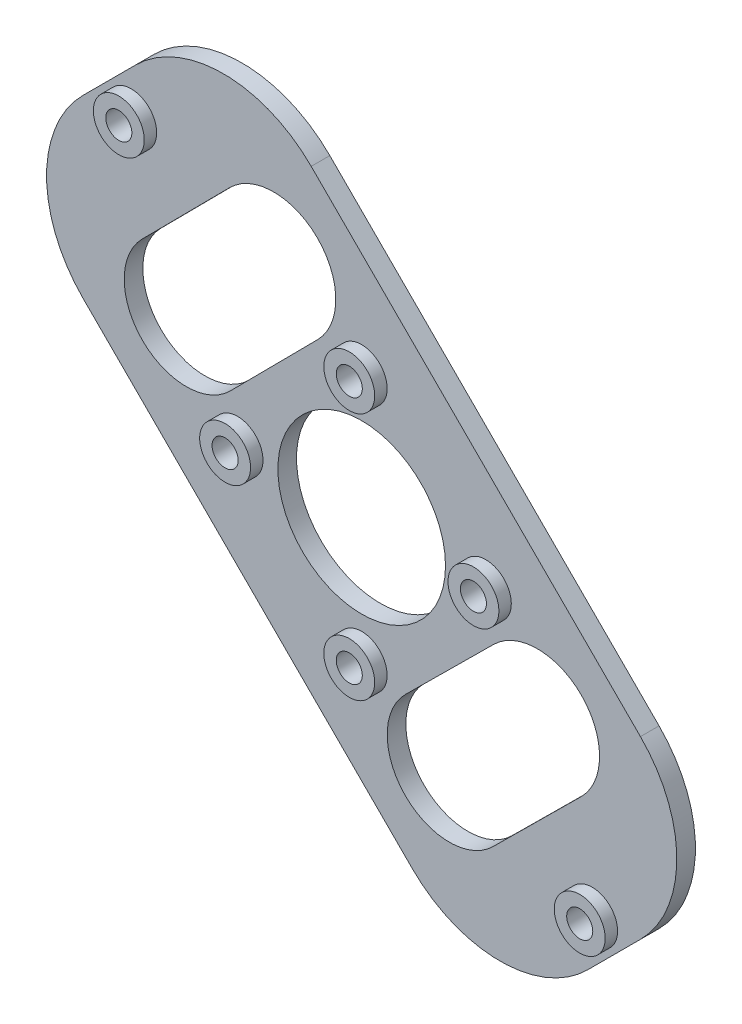
ISO-10303-21;
HEADER;
FILE_DESCRIPTION(('STEP AP214'),'2;1');
FILE_NAME('part.step','',(''),(''),'','','');
FILE_SCHEMA(('AUTOMOTIVE_DESIGN { 1 0 10303 214 1 1 1 1 }'));
ENDSEC;
DATA;
#1=APPLICATION_CONTEXT('core data for automotive mechanical design processes');
#2=APPLICATION_PROTOCOL_DEFINITION('international standard','automotive_design',2000,#1);
#3=PRODUCT_CONTEXT('',#1,'mechanical');
#4=PRODUCT('Part','Part','',(#3));
#5=PRODUCT_RELATED_PRODUCT_CATEGORY('part','',(#4));
#6=PRODUCT_DEFINITION_FORMATION('','',#4);
#7=PRODUCT_DEFINITION_CONTEXT('part definition',#1,'design');
#8=PRODUCT_DEFINITION('design','',#6,#7);
#9=PRODUCT_DEFINITION_SHAPE('','',#8);
#10=(LENGTH_UNIT() NAMED_UNIT(*) SI_UNIT(.MILLI.,.METRE.));
#11=(NAMED_UNIT(*) PLANE_ANGLE_UNIT() SI_UNIT($,.RADIAN.));
#12=(NAMED_UNIT(*) SI_UNIT($,.STERADIAN.) SOLID_ANGLE_UNIT());
#13=UNCERTAINTY_MEASURE_WITH_UNIT(LENGTH_MEASURE(1.E-05),#10,'distance_accuracy_value','');
#14=(GEOMETRIC_REPRESENTATION_CONTEXT(3) GLOBAL_UNCERTAINTY_ASSIGNED_CONTEXT((#13)) GLOBAL_UNIT_ASSIGNED_CONTEXT((#10,
#11,#12)) REPRESENTATION_CONTEXT('',''));
#15=CARTESIAN_POINT('',(0.,0.,0.));
#16=DIRECTION('',(0.,0.,1.));
#17=DIRECTION('',(1.,0.,0.));
#18=AXIS2_PLACEMENT_3D('',#15,#16,#17);
#19=CARTESIAN_POINT('',(0.,0.,3.));
#20=DIRECTION('',(0.,0.,1.));
#21=DIRECTION('',(1.,0.,0.));
#22=AXIS2_PLACEMENT_3D('',#19,#20,#21);
#23=PLANE('',#22);
#24=CARTESIAN_POINT('',(14.1102125568577,-28.2522034055175,3.));
#25=DIRECTION('',(0.,0.,1.));
#26=DIRECTION('',(-1.,0.,0.));
#27=AXIS2_PLACEMENT_3D('',#24,#25,#26);
#28=CIRCLE('',#27,10.0000000000006);
#29=CARTESIAN_POINT('',(7.07121258693556,-21.1492125267777,3.));
#30=VERTEX_POINT('',#29);
#31=CARTESIAN_POINT('',(21.1492125267789,-35.3551942842565,3.));
#32=VERTEX_POINT('',#31);
#33=EDGE_CURVE('E154',#30,#32,#28,.T.);
#34=ORIENTED_EDGE('',*,*,#33,.F.);
#35=DIRECTION('',(-0.710299087873914,-0.703899996992105,0.));
#36=VECTOR('',#35,1.);
#37=CARTESIAN_POINT('',(7.07121258693556,-21.1492125267777,3.));
#38=LINE('',#37,#36);
#39=CARTESIAN_POINT('',(21.2771943444149,-7.07121258693505,3.));
#40=VERTEX_POINT('',#39);
#41=EDGE_CURVE('E172',#40,#30,#38,.T.);
#42=ORIENTED_EDGE('',*,*,#41,.F.);
#43=CARTESIAN_POINT('',(28.3161943143356,-14.174203465675,3.));
#44=DIRECTION('',(0.,0.,1.));
#45=DIRECTION('',(-1.,0.,0.));
#46=AXIS2_PLACEMENT_3D('',#43,#44,#45);
#47=CIRCLE('',#46,10.0000000000003);
#48=CARTESIAN_POINT('',(35.3551942842568,-21.277194344414,3.));
#49=VERTEX_POINT('',#48);
#50=EDGE_CURVE('E175',#49,#40,#47,.T.);
#51=ORIENTED_EDGE('',*,*,#50,.F.);
#52=DIRECTION('',(0.710299087873895,0.703899996992124,0.));
#53=VECTOR('',#52,1.);
#54=CARTESIAN_POINT('',(21.1492125267789,-35.3551942842565,3.));
#55=LINE('',#54,#53);
#56=EDGE_CURVE('E181',#32,#49,#55,.T.);
#57=ORIENTED_EDGE('',*,*,#56,.F.);
#58=EDGE_LOOP('',(#34,#42,#51,#57));
#59=FACE_BOUND('',#58,.T.);
#60=CARTESIAN_POINT('',(-28.2522034055178,14.1102125568572,3.));
#61=DIRECTION('',(0.,0.,1.));
#62=DIRECTION('',(1.,0.,0.));
#63=AXIS2_PLACEMENT_3D('',#60,#61,#62);
#64=CIRCLE('',#63,9.99999999999996);
#65=CARTESIAN_POINT('',(-35.3551942842568,21.1492125267783,3.));
#66=VERTEX_POINT('',#65);
#67=CARTESIAN_POINT('',(-21.1492125267788,7.07121258693604,3.));
#68=VERTEX_POINT('',#67);
#69=EDGE_CURVE('E187',#66,#68,#64,.T.);
#70=ORIENTED_EDGE('',*,*,#69,.F.);
#71=DIRECTION('',(-0.703899996992114,-0.710299087873905,0.));
#72=VECTOR('',#71,1.);
#73=CARTESIAN_POINT('',(-35.3551942842568,21.1492125267783,3.));
#74=LINE('',#73,#72);
#75=CARTESIAN_POINT('',(-21.2771943444144,35.3551942842564,3.));
#76=VERTEX_POINT('',#75);
#77=EDGE_CURVE('E195',#76,#66,#74,.T.);
#78=ORIENTED_EDGE('',*,*,#77,.F.);
#79=CARTESIAN_POINT('',(-14.1742034656754,28.3161943143353,3.));
#80=DIRECTION('',(0.,0.,1.));
#81=DIRECTION('',(1.,0.,0.));
#82=AXIS2_PLACEMENT_3D('',#79,#80,#81);
#83=CIRCLE('',#82,10.);
#84=CARTESIAN_POINT('',(-7.07121258693641,21.2771943444141,3.));
#85=VERTEX_POINT('',#84);
#86=EDGE_CURVE('E209',#85,#76,#83,.T.);
#87=ORIENTED_EDGE('',*,*,#86,.F.);
#88=DIRECTION('',(0.703899996992118,0.710299087873902,0.));
#89=VECTOR('',#88,1.);
#90=CARTESIAN_POINT('',(-21.1492125267788,7.07121258693604,3.));
#91=LINE('',#90,#89);
#92=EDGE_CURVE('E206',#68,#85,#91,.T.);
#93=ORIENTED_EDGE('',*,*,#92,.F.);
#94=EDGE_LOOP('',(#70,#78,#87,#93));
#95=FACE_BOUND('',#94,.T.);
#96=CARTESIAN_POINT('',(-37.1231060122948,37.123106012294,3.));
#97=DIRECTION('',(0.,0.,1.));
#98=DIRECTION('',(1.,0.,0.));
#99=AXIS2_PLACEMENT_3D('',#96,#97,#98);
#100=CIRCLE('',#99,4.09999999999999);
#101=CARTESIAN_POINT('',(-33.0231060122948,37.123106012294,3.));
#102=VERTEX_POINT('',#101);
#103=EDGE_CURVE('E234',#102,#102,#100,.T.);
#104=ORIENTED_EDGE('',*,*,#103,.F.);
#105=EDGE_LOOP('',(#104));
#106=FACE_BOUND('',#105,.T.);
#107=CARTESIAN_POINT('',(1.13196979001957E-12,-20.,3.));
#108=DIRECTION('',(0.,0.,1.));
#109=DIRECTION('',(1.,0.,0.));
#110=AXIS2_PLACEMENT_3D('',#107,#108,#109);
#111=CIRCLE('',#110,4.10000000000122);
#112=CARTESIAN_POINT('',(4.10000000000235,-20.,3.));
#113=VERTEX_POINT('',#112);
#114=EDGE_CURVE('E252',#113,#113,#111,.T.);
#115=ORIENTED_EDGE('',*,*,#114,.F.);
#116=EDGE_LOOP('',(#115));
#117=FACE_BOUND('',#116,.T.);
#118=CARTESIAN_POINT('',(37.123106012293,-37.1231060122933,3.));
#119=DIRECTION('',(0.,0.,1.));
#120=DIRECTION('',(1.,0.,0.));
#121=AXIS2_PLACEMENT_3D('',#118,#119,#120);
#122=CIRCLE('',#121,4.09999999999999);
#123=CARTESIAN_POINT('',(41.223106012293,-37.1231060122933,3.));
#124=VERTEX_POINT('',#123);
#125=EDGE_CURVE('E270',#124,#124,#122,.T.);
#126=ORIENTED_EDGE('',*,*,#125,.F.);
#127=EDGE_LOOP('',(#126));
#128=FACE_BOUND('',#127,.T.);
#129=CARTESIAN_POINT('',(0.,0.,3.));
#130=DIRECTION('',(0.,0.,1.));
#131=DIRECTION('',(1.,0.,0.));
#132=AXIS2_PLACEMENT_3D('',#129,#130,#131);
#133=CIRCLE('',#132,13.5);
#134=CARTESIAN_POINT('',(13.5,0.,3.));
#135=VERTEX_POINT('',#134);
#136=EDGE_CURVE('E292',#135,#135,#133,.T.);
#137=ORIENTED_EDGE('',*,*,#136,.F.);
#138=EDGE_LOOP('',(#137));
#139=FACE_BOUND('',#138,.T.);
#140=DIRECTION('',(0.707106781186549,-0.707106781186546,0.));
#141=VECTOR('',#140,1.);
#142=CARTESIAN_POINT('',(22.2738636073754,-59.0434162290763,3.));
#143=LINE('',#142,#141);
#144=CARTESIAN_POINT('',(-44.9012806053467,8.13172798364563,3.));
#145=VERTEX_POINT('',#144);
#146=CARTESIAN_POINT('',(8.13172798364444,-44.9012806053454,3.));
#147=VERTEX_POINT('',#146);
#148=EDGE_CURVE('E309',#145,#147,#143,.T.);
#149=ORIENTED_EDGE('',*,*,#148,.T.);
#150=CARTESIAN_POINT('',(22.2738636073754,-30.7591449816144,3.));
#151=DIRECTION('',(0.,0.,1.));
#152=DIRECTION('',(1.,0.,0.));
#153=AXIS2_PLACEMENT_3D('',#150,#151,#152);
#154=CIRCLE('',#153,20.);
#155=CARTESIAN_POINT('',(36.4159992311063,-44.9012806053453,3.));
#156=VERTEX_POINT('',#155);
#157=EDGE_CURVE('E344',#147,#156,#154,.T.);
#158=ORIENTED_EDGE('',*,*,#157,.T.);
#159=DIRECTION('',(0.707106781186546,0.707106781186549,0.));
#160=VECTOR('',#159,1.);
#161=CARTESIAN_POINT('',(22.2738636073754,-59.0434162290763,3.));
#162=LINE('',#161,#160);
#163=CARTESIAN_POINT('',(44.9012806053449,-36.4159992311068,3.));
#164=VERTEX_POINT('',#163);
#165=EDGE_CURVE('E301',#156,#164,#162,.T.);
#166=ORIENTED_EDGE('',*,*,#165,.T.);
#167=CARTESIAN_POINT('',(30.7591449816139,-22.2738636073758,3.));
#168=DIRECTION('',(0.,0.,1.));
#169=DIRECTION('',(1.,0.,0.));
#170=AXIS2_PLACEMENT_3D('',#167,#168,#169);
#171=CIRCLE('',#170,20.);
#172=CARTESIAN_POINT('',(44.9012806053448,-8.13172798364486,3.));
#173=VERTEX_POINT('',#172);
#174=EDGE_CURVE('E342',#164,#173,#171,.T.);
#175=ORIENTED_EDGE('',*,*,#174,.T.);
#176=DIRECTION('',(-0.707106781186549,0.707106781186546,0.));
#177=VECTOR('',#176,1.);
#178=CARTESIAN_POINT('',(59.0434162290758,-22.2738636073758,3.));
#179=LINE('',#178,#177);
#180=CARTESIAN_POINT('',(-8.13172798364629,44.9012806053461,3.));
#181=VERTEX_POINT('',#180);
#182=EDGE_CURVE('E304',#173,#181,#179,.T.);
#183=ORIENTED_EDGE('',*,*,#182,.T.);
#184=CARTESIAN_POINT('',(-22.2738636073772,30.7591449816152,3.));
#185=DIRECTION('',(0.,0.,1.));
#186=DIRECTION('',(1.,0.,0.));
#187=AXIS2_PLACEMENT_3D('',#184,#185,#186);
#188=CIRCLE('',#187,20.);
#189=CARTESIAN_POINT('',(-36.4159992311082,44.9012806053461,3.));
#190=VERTEX_POINT('',#189);
#191=EDGE_CURVE('E54',#181,#190,#188,.T.);
#192=ORIENTED_EDGE('',*,*,#191,.T.);
#193=DIRECTION('',(-0.707106781186546,-0.707106781186549,0.));
#194=VECTOR('',#193,1.);
#195=CARTESIAN_POINT('',(-59.0434162290777,22.2738636073765,3.));
#196=LINE('',#195,#194);
#197=CARTESIAN_POINT('',(-44.9012806053468,36.4159992311075,3.));
#198=VERTEX_POINT('',#197);
#199=EDGE_CURVE('E307',#190,#198,#196,.T.);
#200=ORIENTED_EDGE('',*,*,#199,.T.);
#201=CARTESIAN_POINT('',(-30.7591449816158,22.2738636073766,3.));
#202=DIRECTION('',(0.,0.,1.));
#203=DIRECTION('',(1.,0.,0.));
#204=AXIS2_PLACEMENT_3D('',#201,#202,#203);
#205=CIRCLE('',#204,20.);
#206=EDGE_CURVE('E339',#198,#145,#205,.T.);
#207=ORIENTED_EDGE('',*,*,#206,.T.);
#208=EDGE_LOOP('',(#149,#158,#166,#175,#183,#192,#200,#207));
#209=FACE_BOUND('',#208,.T.);
#210=CARTESIAN_POINT('',(20.0000000000006,5.65984895009785E-13,3.));
#211=DIRECTION('',(0.,0.,1.));
#212=DIRECTION('',(1.,0.,0.));
#213=AXIS2_PLACEMENT_3D('',#210,#211,#212);
#214=CIRCLE('',#213,4.10000000000044);
#215=CARTESIAN_POINT('',(24.100000000001,5.65984895009785E-13,3.));
#216=VERTEX_POINT('',#215);
#217=EDGE_CURVE('E261',#216,#216,#214,.T.);
#218=ORIENTED_EDGE('',*,*,#217,.F.);
#219=EDGE_LOOP('',(#218));
#220=FACE_BOUND('',#219,.T.);
#221=CARTESIAN_POINT('',(-19.9999999999994,-5.6843418860808E-13,3.));
#222=DIRECTION('',(0.,0.,1.));
#223=DIRECTION('',(1.,0.,0.));
#224=AXIS2_PLACEMENT_3D('',#221,#222,#223);
#225=CIRCLE('',#224,4.10000000000091);
#226=CARTESIAN_POINT('',(-15.8999999999985,-5.6843418860808E-13,3.));
#227=VERTEX_POINT('',#226);
#228=EDGE_CURVE('E243',#227,#227,#225,.T.);
#229=ORIENTED_EDGE('',*,*,#228,.F.);
#230=EDGE_LOOP('',(#229));
#231=FACE_BOUND('',#230,.T.);
#232=CARTESIAN_POINT('',(0.,20.,3.));
#233=DIRECTION('',(0.,0.,1.));
#234=DIRECTION('',(1.,0.,0.));
#235=AXIS2_PLACEMENT_3D('',#232,#233,#234);
#236=CIRCLE('',#235,4.1);
#237=CARTESIAN_POINT('',(4.1,20.,3.));
#238=VERTEX_POINT('',#237);
#239=EDGE_CURVE('E225',#238,#238,#236,.T.);
#240=ORIENTED_EDGE('',*,*,#239,.F.);
#241=EDGE_LOOP('',(#240));
#242=FACE_BOUND('',#241,.T.);
#243=ADVANCED_FACE('F33',(#59,#95,#106,#117,#128,#139,#209,#220,#231,#242),#23,.T.);
#244=CARTESIAN_POINT('',(0.,0.,0.));
#245=DIRECTION('',(0.,0.,1.));
#246=DIRECTION('',(1.,0.,0.));
#247=AXIS2_PLACEMENT_3D('',#244,#245,#246);
#248=PLANE('',#247);
#249=DIRECTION('',(-0.710299087873914,-0.703899996992105,0.));
#250=VECTOR('',#249,1.);
#251=CARTESIAN_POINT('',(7.07121258693556,-21.1492125267777,0.));
#252=LINE('',#251,#250);
#253=CARTESIAN_POINT('',(21.2771943444149,-7.07121258693505,0.));
#254=VERTEX_POINT('',#253);
#255=CARTESIAN_POINT('',(7.07121258693556,-21.1492125267777,0.));
#256=VERTEX_POINT('',#255);
#257=EDGE_CURVE('E159',#254,#256,#252,.T.);
#258=ORIENTED_EDGE('',*,*,#257,.T.);
#259=CARTESIAN_POINT('',(14.1102125568577,-28.2522034055175,0.));
#260=DIRECTION('',(0.,0.,1.));
#261=DIRECTION('',(-1.,0.,0.));
#262=AXIS2_PLACEMENT_3D('',#259,#260,#261);
#263=CIRCLE('',#262,10.0000000000006);
#264=CARTESIAN_POINT('',(21.1492125267789,-35.3551942842565,0.));
#265=VERTEX_POINT('',#264);
#266=EDGE_CURVE('E151',#256,#265,#263,.T.);
#267=ORIENTED_EDGE('',*,*,#266,.T.);
#268=DIRECTION('',(0.710299087873895,0.703899996992124,0.));
#269=VECTOR('',#268,1.);
#270=CARTESIAN_POINT('',(21.1492125267789,-35.3551942842565,0.));
#271=LINE('',#270,#269);
#272=CARTESIAN_POINT('',(35.3551942842568,-21.277194344414,0.));
#273=VERTEX_POINT('',#272);
#274=EDGE_CURVE('E163',#265,#273,#271,.T.);
#275=ORIENTED_EDGE('',*,*,#274,.T.);
#276=CARTESIAN_POINT('',(28.3161943143356,-14.174203465675,0.));
#277=DIRECTION('',(0.,0.,1.));
#278=DIRECTION('',(-1.,0.,0.));
#279=AXIS2_PLACEMENT_3D('',#276,#277,#278);
#280=CIRCLE('',#279,10.0000000000003);
#281=EDGE_CURVE('E167',#273,#254,#280,.T.);
#282=ORIENTED_EDGE('',*,*,#281,.T.);
#283=EDGE_LOOP('',(#258,#267,#275,#282));
#284=FACE_BOUND('',#283,.T.);
#285=DIRECTION('',(-0.703899996992114,-0.710299087873905,0.));
#286=VECTOR('',#285,1.);
#287=CARTESIAN_POINT('',(-35.3551942842568,21.1492125267783,0.));
#288=LINE('',#287,#286);
#289=CARTESIAN_POINT('',(-21.2771943444144,35.3551942842564,0.));
#290=VERTEX_POINT('',#289);
#291=CARTESIAN_POINT('',(-35.3551942842568,21.1492125267783,0.));
#292=VERTEX_POINT('',#291);
#293=EDGE_CURVE('E201',#290,#292,#288,.T.);
#294=ORIENTED_EDGE('',*,*,#293,.T.);
#295=CARTESIAN_POINT('',(-28.2522034055178,14.1102125568572,0.));
#296=DIRECTION('',(0.,0.,1.));
#297=DIRECTION('',(1.,0.,0.));
#298=AXIS2_PLACEMENT_3D('',#295,#296,#297);
#299=CIRCLE('',#298,9.99999999999996);
#300=CARTESIAN_POINT('',(-21.1492125267788,7.07121258693604,0.));
#301=VERTEX_POINT('',#300);
#302=EDGE_CURVE('E191',#292,#301,#299,.T.);
#303=ORIENTED_EDGE('',*,*,#302,.T.);
#304=DIRECTION('',(0.703899996992118,0.710299087873902,0.));
#305=VECTOR('',#304,1.);
#306=CARTESIAN_POINT('',(-21.1492125267788,7.07121258693604,0.));
#307=LINE('',#306,#305);
#308=CARTESIAN_POINT('',(-7.0712125869364,21.2771943444141,0.));
#309=VERTEX_POINT('',#308);
#310=EDGE_CURVE('E194',#301,#309,#307,.T.);
#311=ORIENTED_EDGE('',*,*,#310,.T.);
#312=CARTESIAN_POINT('',(-14.1742034656754,28.3161943143353,0.));
#313=DIRECTION('',(0.,0.,1.));
#314=DIRECTION('',(1.,0.,0.));
#315=AXIS2_PLACEMENT_3D('',#312,#313,#314);
#316=CIRCLE('',#315,10.);
#317=EDGE_CURVE('E198',#309,#290,#316,.T.);
#318=ORIENTED_EDGE('',*,*,#317,.T.);
#319=EDGE_LOOP('',(#294,#303,#311,#318));
#320=FACE_BOUND('',#319,.T.);
#321=CARTESIAN_POINT('',(37.123106012293,-37.1231060122933,0.));
#322=DIRECTION('',(0.,0.,1.));
#323=DIRECTION('',(-1.,0.,0.));
#324=AXIS2_PLACEMENT_3D('',#321,#322,#323);
#325=CIRCLE('',#324,2.09999999999999);
#326=CARTESIAN_POINT('',(35.023106012293,-37.1231060122933,0.));
#327=VERTEX_POINT('',#326);
#328=EDGE_CURVE('E274',#327,#327,#325,.T.);
#329=ORIENTED_EDGE('',*,*,#328,.T.);
#330=EDGE_LOOP('',(#329));
#331=FACE_BOUND('',#330,.T.);
#332=CARTESIAN_POINT('',(-37.1231060122948,37.123106012294,0.));
#333=DIRECTION('',(0.,0.,1.));
#334=DIRECTION('',(1.,0.,0.));
#335=AXIS2_PLACEMENT_3D('',#332,#333,#334);
#336=CIRCLE('',#335,2.1);
#337=CARTESIAN_POINT('',(-35.0231060122948,37.123106012294,0.));
#338=VERTEX_POINT('',#337);
#339=EDGE_CURVE('E279',#338,#338,#336,.T.);
#340=ORIENTED_EDGE('',*,*,#339,.T.);
#341=EDGE_LOOP('',(#340));
#342=FACE_BOUND('',#341,.T.);
#343=DIRECTION('',(0.707106781186546,0.707106781186549,0.));
#344=VECTOR('',#343,1.);
#345=CARTESIAN_POINT('',(22.2738636073754,-59.0434162290763,0.));
#346=LINE('',#345,#344);
#347=CARTESIAN_POINT('',(36.4159992311063,-44.9012806053453,0.));
#348=VERTEX_POINT('',#347);
#349=CARTESIAN_POINT('',(44.9012806053449,-36.4159992311068,0.));
#350=VERTEX_POINT('',#349);
#351=EDGE_CURVE('E300',#348,#350,#346,.T.);
#352=ORIENTED_EDGE('',*,*,#351,.F.);
#353=CARTESIAN_POINT('',(22.2738636073754,-30.7591449816144,0.));
#354=DIRECTION('',(0.,0.,1.));
#355=DIRECTION('',(1.,0.,0.));
#356=AXIS2_PLACEMENT_3D('',#353,#354,#355);
#357=CIRCLE('',#356,20.);
#358=CARTESIAN_POINT('',(8.13172798364444,-44.9012806053454,0.));
#359=VERTEX_POINT('',#358);
#360=EDGE_CURVE('E332',#348,#359,#357,.F.);
#361=ORIENTED_EDGE('',*,*,#360,.T.);
#362=DIRECTION('',(0.707106781186549,-0.707106781186546,0.));
#363=VECTOR('',#362,1.);
#364=CARTESIAN_POINT('',(22.2738636073754,-59.0434162290763,0.));
#365=LINE('',#364,#363);
#366=CARTESIAN_POINT('',(-44.9012806053467,8.13172798364563,0.));
#367=VERTEX_POINT('',#366);
#368=EDGE_CURVE('E305',#367,#359,#365,.T.);
#369=ORIENTED_EDGE('',*,*,#368,.F.);
#370=CARTESIAN_POINT('',(-30.7591449816158,22.2738636073766,0.));
#371=DIRECTION('',(0.,0.,1.));
#372=DIRECTION('',(1.,0.,0.));
#373=AXIS2_PLACEMENT_3D('',#370,#371,#372);
#374=CIRCLE('',#373,20.);
#375=CARTESIAN_POINT('',(-44.9012806053468,36.4159992311075,0.));
#376=VERTEX_POINT('',#375);
#377=EDGE_CURVE('E326',#367,#376,#374,.F.);
#378=ORIENTED_EDGE('',*,*,#377,.T.);
#379=DIRECTION('',(-0.707106781186546,-0.707106781186549,0.));
#380=VECTOR('',#379,1.);
#381=CARTESIAN_POINT('',(-59.0434162290777,22.2738636073765,0.));
#382=LINE('',#381,#380);
#383=CARTESIAN_POINT('',(-36.4159992311082,44.9012806053461,0.));
#384=VERTEX_POINT('',#383);
#385=EDGE_CURVE('E318',#384,#376,#382,.T.);
#386=ORIENTED_EDGE('',*,*,#385,.F.);
#387=CARTESIAN_POINT('',(-22.2738636073772,30.7591449816152,0.));
#388=DIRECTION('',(0.,0.,1.));
#389=DIRECTION('',(1.,0.,0.));
#390=AXIS2_PLACEMENT_3D('',#387,#388,#389);
#391=CIRCLE('',#390,20.);
#392=CARTESIAN_POINT('',(-8.13172798364629,44.9012806053461,0.));
#393=VERTEX_POINT('',#392);
#394=EDGE_CURVE('E328',#384,#393,#391,.F.);
#395=ORIENTED_EDGE('',*,*,#394,.T.);
#396=DIRECTION('',(-0.707106781186549,0.707106781186546,0.));
#397=VECTOR('',#396,1.);
#398=CARTESIAN_POINT('',(59.0434162290758,-22.2738636073758,0.));
#399=LINE('',#398,#397);
#400=CARTESIAN_POINT('',(44.9012806053448,-8.13172798364486,0.));
#401=VERTEX_POINT('',#400);
#402=EDGE_CURVE('E315',#401,#393,#399,.T.);
#403=ORIENTED_EDGE('',*,*,#402,.F.);
#404=CARTESIAN_POINT('',(30.7591449816139,-22.2738636073758,0.));
#405=DIRECTION('',(0.,0.,1.));
#406=DIRECTION('',(1.,0.,0.));
#407=AXIS2_PLACEMENT_3D('',#404,#405,#406);
#408=CIRCLE('',#407,20.);
#409=EDGE_CURVE('E330',#401,#350,#408,.F.);
#410=ORIENTED_EDGE('',*,*,#409,.T.);
#411=EDGE_LOOP('',(#352,#361,#369,#378,#386,#395,#403,#410));
#412=FACE_BOUND('',#411,.T.);
#413=CARTESIAN_POINT('',(0.,20.,0.));
#414=DIRECTION('',(0.,0.,1.));
#415=DIRECTION('',(1.,0.,0.));
#416=AXIS2_PLACEMENT_3D('',#413,#414,#415);
#417=CIRCLE('',#416,2.1);
#418=CARTESIAN_POINT('',(2.1,20.,0.));
#419=VERTEX_POINT('',#418);
#420=EDGE_CURVE('E295',#419,#419,#417,.T.);
#421=ORIENTED_EDGE('',*,*,#420,.T.);
#422=EDGE_LOOP('',(#421));
#423=FACE_BOUND('',#422,.T.);
#424=CARTESIAN_POINT('',(0.,0.,0.));
#425=DIRECTION('',(0.,0.,1.));
#426=DIRECTION('',(1.,0.,0.));
#427=AXIS2_PLACEMENT_3D('',#424,#425,#426);
#428=CIRCLE('',#427,13.5);
#429=CARTESIAN_POINT('',(13.5,0.,0.));
#430=VERTEX_POINT('',#429);
#431=EDGE_CURVE('E291',#430,#430,#428,.T.);
#432=ORIENTED_EDGE('',*,*,#431,.T.);
#433=EDGE_LOOP('',(#432));
#434=FACE_BOUND('',#433,.T.);
#435=CARTESIAN_POINT('',(20.0000000000006,5.65984895009785E-13,0.));
#436=DIRECTION('',(0.,0.,1.));
#437=DIRECTION('',(1.,0.,0.));
#438=AXIS2_PLACEMENT_3D('',#435,#436,#437);
#439=CIRCLE('',#438,2.10000000000044);
#440=CARTESIAN_POINT('',(22.100000000001,5.65984895009785E-13,0.));
#441=VERTEX_POINT('',#440);
#442=EDGE_CURVE('E288',#441,#441,#439,.T.);
#443=ORIENTED_EDGE('',*,*,#442,.T.);
#444=EDGE_LOOP('',(#443));
#445=FACE_BOUND('',#444,.T.);
#446=CARTESIAN_POINT('',(1.13196979001957E-12,-20.,0.));
#447=DIRECTION('',(0.,0.,1.));
#448=DIRECTION('',(1.,0.,0.));
#449=AXIS2_PLACEMENT_3D('',#446,#447,#448);
#450=CIRCLE('',#449,2.10000000000122);
#451=CARTESIAN_POINT('',(2.10000000000235,-20.,0.));
#452=VERTEX_POINT('',#451);
#453=EDGE_CURVE('E285',#452,#452,#450,.T.);
#454=ORIENTED_EDGE('',*,*,#453,.T.);
#455=EDGE_LOOP('',(#454));
#456=FACE_BOUND('',#455,.T.);
#457=CARTESIAN_POINT('',(-19.9999999999994,-5.6843418860808E-13,0.));
#458=DIRECTION('',(0.,0.,1.));
#459=DIRECTION('',(1.,0.,0.));
#460=AXIS2_PLACEMENT_3D('',#457,#458,#459);
#461=CIRCLE('',#460,2.10000000000091);
#462=CARTESIAN_POINT('',(-17.8999999999985,-5.6843418860808E-13,0.));
#463=VERTEX_POINT('',#462);
#464=EDGE_CURVE('E282',#463,#463,#461,.T.);
#465=ORIENTED_EDGE('',*,*,#464,.T.);
#466=EDGE_LOOP('',(#465));
#467=FACE_BOUND('',#466,.T.);
#468=ADVANCED_FACE('F169',(#284,#320,#331,#342,#412,#423,#434,#445,#456,#467),#248,.F.);
#469=CARTESIAN_POINT('',(22.2738636073754,-59.0434162290763,3.));
#470=DIRECTION('',(-0.707106781186549,0.707106781186546,0.));
#471=DIRECTION('',(-0.707106781186546,-0.707106781186549,0.));
#472=AXIS2_PLACEMENT_3D('',#469,#470,#471);
#473=PLANE('',#472);
#474=ORIENTED_EDGE('',*,*,#165,.F.);
#475=DIRECTION('',(0.,0.,-1.));
#476=VECTOR('',#475,1.);
#477=CARTESIAN_POINT('',(36.4159992311063,-44.9012806053453,3.));
#478=LINE('',#477,#476);
#479=EDGE_CURVE('E323',#156,#348,#478,.T.);
#480=ORIENTED_EDGE('',*,*,#479,.T.);
#481=ORIENTED_EDGE('',*,*,#351,.T.);
#482=DIRECTION('',(0.,0.,-1.));
#483=VECTOR('',#482,1.);
#484=CARTESIAN_POINT('',(44.9012806053449,-36.4159992311067,3.));
#485=LINE('',#484,#483);
#486=EDGE_CURVE('E312',#350,#164,#485,.F.);
#487=ORIENTED_EDGE('',*,*,#486,.T.);
#488=EDGE_LOOP('',(#474,#480,#481,#487));
#489=FACE_BOUND('',#488,.T.);
#490=ADVANCED_FACE('F381',(#489),#473,.F.);
#491=CARTESIAN_POINT('',(59.0434162290758,-22.2738636073758,3.));
#492=DIRECTION('',(-0.707106781186546,-0.707106781186548,0.));
#493=DIRECTION('',(0.707106781186549,-0.707106781186546,0.));
#494=AXIS2_PLACEMENT_3D('',#491,#492,#493);
#495=PLANE('',#494);
#496=ORIENTED_EDGE('',*,*,#182,.F.);
#497=DIRECTION('',(0.,0.,-1.));
#498=VECTOR('',#497,1.);
#499=CARTESIAN_POINT('',(44.9012806053448,-8.13172798364486,3.));
#500=LINE('',#499,#498);
#501=EDGE_CURVE('E348',#173,#401,#500,.T.);
#502=ORIENTED_EDGE('',*,*,#501,.T.);
#503=ORIENTED_EDGE('',*,*,#402,.T.);
#504=DIRECTION('',(0.,0.,-1.));
#505=VECTOR('',#504,1.);
#506=CARTESIAN_POINT('',(-8.13172798364629,44.9012806053461,3.));
#507=LINE('',#506,#505);
#508=EDGE_CURVE('E346',#393,#181,#507,.F.);
#509=ORIENTED_EDGE('',*,*,#508,.T.);
#510=EDGE_LOOP('',(#496,#502,#503,#509));
#511=FACE_BOUND('',#510,.T.);
#512=ADVANCED_FACE('F354',(#511),#495,.F.);
#513=CARTESIAN_POINT('',(-59.0434162290777,22.2738636073765,3.));
#514=DIRECTION('',(0.707106781186549,-0.707106781186546,0.));
#515=DIRECTION('',(0.707106781186546,0.707106781186549,0.));
#516=AXIS2_PLACEMENT_3D('',#513,#514,#515);
#517=PLANE('',#516);
#518=ORIENTED_EDGE('',*,*,#199,.F.);
#519=DIRECTION('',(0.,0.,-1.));
#520=VECTOR('',#519,1.);
#521=CARTESIAN_POINT('',(-36.4159992311082,44.9012806053461,3.));
#522=LINE('',#521,#520);
#523=EDGE_CURVE('E11',#190,#384,#522,.T.);
#524=ORIENTED_EDGE('',*,*,#523,.T.);
#525=ORIENTED_EDGE('',*,*,#385,.T.);
#526=DIRECTION('',(0.,0.,-1.));
#527=VECTOR('',#526,1.);
#528=CARTESIAN_POINT('',(-44.9012806053468,36.4159992311075,3.));
#529=LINE('',#528,#527);
#530=EDGE_CURVE('E41',#376,#198,#529,.F.);
#531=ORIENTED_EDGE('',*,*,#530,.T.);
#532=EDGE_LOOP('',(#518,#524,#525,#531));
#533=FACE_BOUND('',#532,.T.);
#534=ADVANCED_FACE('F365',(#533),#517,.F.);
#535=CARTESIAN_POINT('',(22.2738636073754,-59.0434162290763,3.));
#536=DIRECTION('',(0.707106781186546,0.707106781186549,0.));
#537=DIRECTION('',(-0.707106781186549,0.707106781186546,0.));
#538=AXIS2_PLACEMENT_3D('',#535,#536,#537);
#539=PLANE('',#538);
#540=ORIENTED_EDGE('',*,*,#368,.T.);
#541=DIRECTION('',(0.,0.,-1.));
#542=VECTOR('',#541,1.);
#543=CARTESIAN_POINT('',(8.13172798364445,-44.9012806053454,3.));
#544=LINE('',#543,#542);
#545=EDGE_CURVE('E337',#359,#147,#544,.F.);
#546=ORIENTED_EDGE('',*,*,#545,.T.);
#547=ORIENTED_EDGE('',*,*,#148,.F.);
#548=DIRECTION('',(0.,0.,-1.));
#549=VECTOR('',#548,1.);
#550=CARTESIAN_POINT('',(-44.9012806053467,8.13172798364559,3.));
#551=LINE('',#550,#549);
#552=EDGE_CURVE('E334',#145,#367,#551,.T.);
#553=ORIENTED_EDGE('',*,*,#552,.T.);
#554=EDGE_LOOP('',(#540,#546,#547,#553));
#555=FACE_BOUND('',#554,.T.);
#556=ADVANCED_FACE('F373',(#555),#539,.F.);
#557=CARTESIAN_POINT('',(0.,20.,3.));
#558=DIRECTION('',(0.,0.,-1.));
#559=DIRECTION('',(-1.,0.,0.));
#560=AXIS2_PLACEMENT_3D('',#557,#558,#559);
#561=CYLINDRICAL_SURFACE('',#560,2.1);
#562=ORIENTED_EDGE('',*,*,#420,.F.);
#563=EDGE_LOOP('',(#562));
#564=FACE_BOUND('',#563,.T.);
#565=CARTESIAN_POINT('',(0.,20.,5.));
#566=DIRECTION('',(0.,0.,1.));
#567=DIRECTION('',(1.,0.,0.));
#568=AXIS2_PLACEMENT_3D('',#565,#566,#567);
#569=CIRCLE('',#568,2.1);
#570=CARTESIAN_POINT('',(2.1,20.,5.));
#571=VERTEX_POINT('',#570);
#572=EDGE_CURVE('E216',#571,#571,#569,.T.);
#573=ORIENTED_EDGE('',*,*,#572,.T.);
#574=EDGE_LOOP('',(#573));
#575=FACE_BOUND('',#574,.T.);
#576=ADVANCED_FACE('F400',(#564,#575),#561,.F.);
#577=CARTESIAN_POINT('',(0.,0.,3.));
#578=DIRECTION('',(0.,0.,-1.));
#579=DIRECTION('',(-1.,0.,0.));
#580=AXIS2_PLACEMENT_3D('',#577,#578,#579);
#581=CYLINDRICAL_SURFACE('',#580,13.5);
#582=ORIENTED_EDGE('',*,*,#136,.T.);
#583=EDGE_LOOP('',(#582));
#584=FACE_BOUND('',#583,.T.);
#585=ORIENTED_EDGE('',*,*,#431,.F.);
#586=EDGE_LOOP('',(#585));
#587=FACE_BOUND('',#586,.T.);
#588=ADVANCED_FACE('F433',(#584,#587),#581,.F.);
#589=CARTESIAN_POINT('',(20.0000000000006,5.65984895009785E-13,3.));
#590=DIRECTION('',(0.,0.,-1.));
#591=DIRECTION('',(-1.,0.,0.));
#592=AXIS2_PLACEMENT_3D('',#589,#590,#591);
#593=CYLINDRICAL_SURFACE('',#592,2.10000000000044);
#594=ORIENTED_EDGE('',*,*,#442,.F.);
#595=EDGE_LOOP('',(#594));
#596=FACE_BOUND('',#595,.T.);
#597=CARTESIAN_POINT('',(20.0000000000006,5.65984895009785E-13,5.));
#598=DIRECTION('',(0.,0.,1.));
#599=DIRECTION('',(1.,0.,0.));
#600=AXIS2_PLACEMENT_3D('',#597,#598,#599);
#601=CIRCLE('',#600,2.10000000000044);
#602=CARTESIAN_POINT('',(22.100000000001,5.65984895009785E-13,5.));
#603=VERTEX_POINT('',#602);
#604=EDGE_CURVE('E256',#603,#603,#601,.T.);
#605=ORIENTED_EDGE('',*,*,#604,.T.);
#606=EDGE_LOOP('',(#605));
#607=FACE_BOUND('',#606,.T.);
#608=ADVANCED_FACE('F441',(#596,#607),#593,.F.);
#609=CARTESIAN_POINT('',(1.13196979001957E-12,-20.,3.));
#610=DIRECTION('',(0.,0.,-1.));
#611=DIRECTION('',(-1.,0.,0.));
#612=AXIS2_PLACEMENT_3D('',#609,#610,#611);
#613=CYLINDRICAL_SURFACE('',#612,2.10000000000122);
#614=ORIENTED_EDGE('',*,*,#453,.F.);
#615=EDGE_LOOP('',(#614));
#616=FACE_BOUND('',#615,.T.);
#617=CARTESIAN_POINT('',(1.13196979001957E-12,-20.,5.));
#618=DIRECTION('',(0.,0.,1.));
#619=DIRECTION('',(1.,0.,0.));
#620=AXIS2_PLACEMENT_3D('',#617,#618,#619);
#621=CIRCLE('',#620,2.10000000000122);
#622=CARTESIAN_POINT('',(2.10000000000235,-20.,5.));
#623=VERTEX_POINT('',#622);
#624=EDGE_CURVE('E247',#623,#623,#621,.T.);
#625=ORIENTED_EDGE('',*,*,#624,.T.);
#626=EDGE_LOOP('',(#625));
#627=FACE_BOUND('',#626,.T.);
#628=ADVANCED_FACE('F447',(#616,#627),#613,.F.);
#629=CARTESIAN_POINT('',(-19.9999999999994,-5.6843418860808E-13,3.));
#630=DIRECTION('',(0.,0.,-1.));
#631=DIRECTION('',(-1.,0.,0.));
#632=AXIS2_PLACEMENT_3D('',#629,#630,#631);
#633=CYLINDRICAL_SURFACE('',#632,2.10000000000091);
#634=ORIENTED_EDGE('',*,*,#464,.F.);
#635=EDGE_LOOP('',(#634));
#636=FACE_BOUND('',#635,.T.);
#637=CARTESIAN_POINT('',(-19.9999999999994,-5.6843418860808E-13,5.));
#638=DIRECTION('',(0.,0.,1.));
#639=DIRECTION('',(1.,0.,0.));
#640=AXIS2_PLACEMENT_3D('',#637,#638,#639);
#641=CIRCLE('',#640,2.10000000000091);
#642=CARTESIAN_POINT('',(-17.8999999999985,-5.6843418860808E-13,5.));
#643=VERTEX_POINT('',#642);
#644=EDGE_CURVE('E238',#643,#643,#641,.T.);
#645=ORIENTED_EDGE('',*,*,#644,.T.);
#646=EDGE_LOOP('',(#645));
#647=FACE_BOUND('',#646,.T.);
#648=ADVANCED_FACE('F455',(#636,#647),#633,.F.);
#649=CARTESIAN_POINT('',(-37.1231060122948,37.123106012294,0.));
#650=DIRECTION('',(0.,0.,1.));
#651=DIRECTION('',(1.,0.,0.));
#652=AXIS2_PLACEMENT_3D('',#649,#650,#651);
#653=CYLINDRICAL_SURFACE('',#652,2.1);
#654=ORIENTED_EDGE('',*,*,#339,.F.);
#655=EDGE_LOOP('',(#654));
#656=FACE_BOUND('',#655,.T.);
#657=CARTESIAN_POINT('',(-37.1231060122948,37.123106012294,5.));
#658=DIRECTION('',(0.,0.,1.));
#659=DIRECTION('',(1.,0.,0.));
#660=AXIS2_PLACEMENT_3D('',#657,#658,#659);
#661=CIRCLE('',#660,2.1);
#662=CARTESIAN_POINT('',(-35.0231060122948,37.123106012294,5.));
#663=VERTEX_POINT('',#662);
#664=EDGE_CURVE('E229',#663,#663,#661,.T.);
#665=ORIENTED_EDGE('',*,*,#664,.T.);
#666=EDGE_LOOP('',(#665));
#667=FACE_BOUND('',#666,.T.);
#668=ADVANCED_FACE('F463',(#656,#667),#653,.F.);
#669=CARTESIAN_POINT('',(37.123106012293,-37.1231060122933,0.));
#670=DIRECTION('',(0.,0.,1.));
#671=DIRECTION('',(1.,0.,0.));
#672=AXIS2_PLACEMENT_3D('',#669,#670,#671);
#673=CYLINDRICAL_SURFACE('',#672,2.09999999999999);
#674=ORIENTED_EDGE('',*,*,#328,.F.);
#675=EDGE_LOOP('',(#674));
#676=FACE_BOUND('',#675,.T.);
#677=CARTESIAN_POINT('',(37.123106012293,-37.1231060122933,5.));
#678=DIRECTION('',(0.,0.,1.));
#679=DIRECTION('',(1.,0.,0.));
#680=AXIS2_PLACEMENT_3D('',#677,#678,#679);
#681=CIRCLE('',#680,2.09999999999999);
#682=CARTESIAN_POINT('',(39.223106012293,-37.1231060122933,5.));
#683=VERTEX_POINT('',#682);
#684=EDGE_CURVE('E265',#683,#683,#681,.T.);
#685=ORIENTED_EDGE('',*,*,#684,.T.);
#686=EDGE_LOOP('',(#685));
#687=FACE_BOUND('',#686,.T.);
#688=ADVANCED_FACE('F471',(#676,#687),#673,.F.);
#689=CARTESIAN_POINT('',(37.123106012293,-37.1231060122933,5.));
#690=DIRECTION('',(0.,0.,1.));
#691=DIRECTION('',(1.,0.,0.));
#692=AXIS2_PLACEMENT_3D('',#689,#690,#691);
#693=PLANE('',#692);
#694=CARTESIAN_POINT('',(37.123106012293,-37.1231060122933,5.));
#695=DIRECTION('',(0.,0.,1.));
#696=DIRECTION('',(1.,0.,0.));
#697=AXIS2_PLACEMENT_3D('',#694,#695,#696);
#698=CIRCLE('',#697,4.09999999999999);
#699=CARTESIAN_POINT('',(41.223106012293,-37.1231060122933,5.));
#700=VERTEX_POINT('',#699);
#701=EDGE_CURVE('E271',#700,#700,#698,.T.);
#702=ORIENTED_EDGE('',*,*,#701,.T.);
#703=EDGE_LOOP('',(#702));
#704=FACE_BOUND('',#703,.T.);
#705=ORIENTED_EDGE('',*,*,#684,.F.);
#706=EDGE_LOOP('',(#705));
#707=FACE_BOUND('',#706,.T.);
#708=ADVANCED_FACE('F479',(#704,#707),#693,.T.);
#709=CARTESIAN_POINT('',(37.123106012293,-37.1231060122933,5.));
#710=DIRECTION('',(0.,0.,-1.));
#711=DIRECTION('',(-1.,0.,0.));
#712=AXIS2_PLACEMENT_3D('',#709,#710,#711);
#713=CYLINDRICAL_SURFACE('',#712,4.09999999999999);
#714=ORIENTED_EDGE('',*,*,#701,.F.);
#715=EDGE_LOOP('',(#714));
#716=FACE_BOUND('',#715,.T.);
#717=ORIENTED_EDGE('',*,*,#125,.T.);
#718=EDGE_LOOP('',(#717));
#719=FACE_BOUND('',#718,.T.);
#720=ADVANCED_FACE('F487',(#716,#719),#713,.T.);
#721=CARTESIAN_POINT('',(20.0000000000006,5.65984895009785E-13,5.));
#722=DIRECTION('',(0.,0.,1.));
#723=DIRECTION('',(1.,0.,0.));
#724=AXIS2_PLACEMENT_3D('',#721,#722,#723);
#725=PLANE('',#724);
#726=CARTESIAN_POINT('',(20.0000000000006,5.65984895009785E-13,5.));
#727=DIRECTION('',(0.,0.,1.));
#728=DIRECTION('',(1.,0.,0.));
#729=AXIS2_PLACEMENT_3D('',#726,#727,#728);
#730=CIRCLE('',#729,4.10000000000044);
#731=CARTESIAN_POINT('',(24.100000000001,5.65984895009785E-13,5.));
#732=VERTEX_POINT('',#731);
#733=EDGE_CURVE('E262',#732,#732,#730,.T.);
#734=ORIENTED_EDGE('',*,*,#733,.T.);
#735=EDGE_LOOP('',(#734));
#736=FACE_BOUND('',#735,.T.);
#737=ORIENTED_EDGE('',*,*,#604,.F.);
#738=EDGE_LOOP('',(#737));
#739=FACE_BOUND('',#738,.T.);
#740=ADVANCED_FACE('F495',(#736,#739),#725,.T.);
#741=CARTESIAN_POINT('',(20.0000000000006,5.65984895009785E-13,5.));
#742=DIRECTION('',(0.,0.,-1.));
#743=DIRECTION('',(-1.,0.,0.));
#744=AXIS2_PLACEMENT_3D('',#741,#742,#743);
#745=CYLINDRICAL_SURFACE('',#744,4.10000000000044);
#746=ORIENTED_EDGE('',*,*,#733,.F.);
#747=EDGE_LOOP('',(#746));
#748=FACE_BOUND('',#747,.T.);
#749=ORIENTED_EDGE('',*,*,#217,.T.);
#750=EDGE_LOOP('',(#749));
#751=FACE_BOUND('',#750,.T.);
#752=ADVANCED_FACE('F503',(#748,#751),#745,.T.);
#753=CARTESIAN_POINT('',(1.13196979001957E-12,-20.,5.));
#754=DIRECTION('',(0.,0.,1.));
#755=DIRECTION('',(1.,0.,0.));
#756=AXIS2_PLACEMENT_3D('',#753,#754,#755);
#757=PLANE('',#756);
#758=CARTESIAN_POINT('',(1.13196979001957E-12,-20.,5.));
#759=DIRECTION('',(0.,0.,1.));
#760=DIRECTION('',(1.,0.,0.));
#761=AXIS2_PLACEMENT_3D('',#758,#759,#760);
#762=CIRCLE('',#761,4.10000000000122);
#763=CARTESIAN_POINT('',(4.10000000000235,-20.,5.));
#764=VERTEX_POINT('',#763);
#765=EDGE_CURVE('E253',#764,#764,#762,.T.);
#766=ORIENTED_EDGE('',*,*,#765,.T.);
#767=EDGE_LOOP('',(#766));
#768=FACE_BOUND('',#767,.T.);
#769=ORIENTED_EDGE('',*,*,#624,.F.);
#770=EDGE_LOOP('',(#769));
#771=FACE_BOUND('',#770,.T.);
#772=ADVANCED_FACE('F511',(#768,#771),#757,.T.);
#773=CARTESIAN_POINT('',(1.13196979001957E-12,-20.,5.));
#774=DIRECTION('',(0.,0.,-1.));
#775=DIRECTION('',(-1.,0.,0.));
#776=AXIS2_PLACEMENT_3D('',#773,#774,#775);
#777=CYLINDRICAL_SURFACE('',#776,4.10000000000122);
#778=ORIENTED_EDGE('',*,*,#765,.F.);
#779=EDGE_LOOP('',(#778));
#780=FACE_BOUND('',#779,.T.);
#781=ORIENTED_EDGE('',*,*,#114,.T.);
#782=EDGE_LOOP('',(#781));
#783=FACE_BOUND('',#782,.T.);
#784=ADVANCED_FACE('F519',(#780,#783),#777,.T.);
#785=CARTESIAN_POINT('',(-19.9999999999994,-5.6843418860808E-13,5.));
#786=DIRECTION('',(0.,0.,1.));
#787=DIRECTION('',(1.,0.,0.));
#788=AXIS2_PLACEMENT_3D('',#785,#786,#787);
#789=PLANE('',#788);
#790=CARTESIAN_POINT('',(-19.9999999999994,-5.6843418860808E-13,5.));
#791=DIRECTION('',(0.,0.,1.));
#792=DIRECTION('',(1.,0.,0.));
#793=AXIS2_PLACEMENT_3D('',#790,#791,#792);
#794=CIRCLE('',#793,4.10000000000091);
#795=CARTESIAN_POINT('',(-15.8999999999985,-5.6843418860808E-13,5.));
#796=VERTEX_POINT('',#795);
#797=EDGE_CURVE('E244',#796,#796,#794,.T.);
#798=ORIENTED_EDGE('',*,*,#797,.T.);
#799=EDGE_LOOP('',(#798));
#800=FACE_BOUND('',#799,.T.);
#801=ORIENTED_EDGE('',*,*,#644,.F.);
#802=EDGE_LOOP('',(#801));
#803=FACE_BOUND('',#802,.T.);
#804=ADVANCED_FACE('F527',(#800,#803),#789,.T.);
#805=CARTESIAN_POINT('',(-19.9999999999994,-5.6843418860808E-13,5.));
#806=DIRECTION('',(0.,0.,-1.));
#807=DIRECTION('',(-1.,0.,0.));
#808=AXIS2_PLACEMENT_3D('',#805,#806,#807);
#809=CYLINDRICAL_SURFACE('',#808,4.10000000000091);
#810=ORIENTED_EDGE('',*,*,#797,.F.);
#811=EDGE_LOOP('',(#810));
#812=FACE_BOUND('',#811,.T.);
#813=ORIENTED_EDGE('',*,*,#228,.T.);
#814=EDGE_LOOP('',(#813));
#815=FACE_BOUND('',#814,.T.);
#816=ADVANCED_FACE('F535',(#812,#815),#809,.T.);
#817=CARTESIAN_POINT('',(-37.1231060122948,37.123106012294,5.));
#818=DIRECTION('',(0.,0.,1.));
#819=DIRECTION('',(1.,0.,0.));
#820=AXIS2_PLACEMENT_3D('',#817,#818,#819);
#821=PLANE('',#820);
#822=CARTESIAN_POINT('',(-37.1231060122948,37.123106012294,5.));
#823=DIRECTION('',(0.,0.,1.));
#824=DIRECTION('',(1.,0.,0.));
#825=AXIS2_PLACEMENT_3D('',#822,#823,#824);
#826=CIRCLE('',#825,4.09999999999999);
#827=CARTESIAN_POINT('',(-33.0231060122948,37.123106012294,5.));
#828=VERTEX_POINT('',#827);
#829=EDGE_CURVE('E235',#828,#828,#826,.T.);
#830=ORIENTED_EDGE('',*,*,#829,.T.);
#831=EDGE_LOOP('',(#830));
#832=FACE_BOUND('',#831,.T.);
#833=ORIENTED_EDGE('',*,*,#664,.F.);
#834=EDGE_LOOP('',(#833));
#835=FACE_BOUND('',#834,.T.);
#836=ADVANCED_FACE('F543',(#832,#835),#821,.T.);
#837=CARTESIAN_POINT('',(-37.1231060122948,37.123106012294,5.));
#838=DIRECTION('',(0.,0.,-1.));
#839=DIRECTION('',(-1.,0.,0.));
#840=AXIS2_PLACEMENT_3D('',#837,#838,#839);
#841=CYLINDRICAL_SURFACE('',#840,4.09999999999999);
#842=ORIENTED_EDGE('',*,*,#829,.F.);
#843=EDGE_LOOP('',(#842));
#844=FACE_BOUND('',#843,.T.);
#845=ORIENTED_EDGE('',*,*,#103,.T.);
#846=EDGE_LOOP('',(#845));
#847=FACE_BOUND('',#846,.T.);
#848=ADVANCED_FACE('F551',(#844,#847),#841,.T.);
#849=CARTESIAN_POINT('',(0.,20.,5.));
#850=DIRECTION('',(0.,0.,1.));
#851=DIRECTION('',(1.,0.,0.));
#852=AXIS2_PLACEMENT_3D('',#849,#850,#851);
#853=PLANE('',#852);
#854=CARTESIAN_POINT('',(0.,20.,5.));
#855=DIRECTION('',(0.,0.,1.));
#856=DIRECTION('',(1.,0.,0.));
#857=AXIS2_PLACEMENT_3D('',#854,#855,#856);
#858=CIRCLE('',#857,4.1);
#859=CARTESIAN_POINT('',(4.1,20.,5.));
#860=VERTEX_POINT('',#859);
#861=EDGE_CURVE('E226',#860,#860,#858,.T.);
#862=ORIENTED_EDGE('',*,*,#861,.T.);
#863=EDGE_LOOP('',(#862));
#864=FACE_BOUND('',#863,.T.);
#865=ORIENTED_EDGE('',*,*,#572,.F.);
#866=EDGE_LOOP('',(#865));
#867=FACE_BOUND('',#866,.T.);
#868=ADVANCED_FACE('F559',(#864,#867),#853,.T.);
#869=CARTESIAN_POINT('',(0.,20.,5.));
#870=DIRECTION('',(0.,0.,-1.));
#871=DIRECTION('',(-1.,0.,0.));
#872=AXIS2_PLACEMENT_3D('',#869,#870,#871);
#873=CYLINDRICAL_SURFACE('',#872,4.1);
#874=ORIENTED_EDGE('',*,*,#861,.F.);
#875=EDGE_LOOP('',(#874));
#876=FACE_BOUND('',#875,.T.);
#877=ORIENTED_EDGE('',*,*,#239,.T.);
#878=EDGE_LOOP('',(#877));
#879=FACE_BOUND('',#878,.T.);
#880=ADVANCED_FACE('F567',(#876,#879),#873,.T.);
#881=CARTESIAN_POINT('',(-28.2522034055178,14.1102125568572,0.));
#882=DIRECTION('',(0.,0.,1.));
#883=DIRECTION('',(1.,0.,0.));
#884=AXIS2_PLACEMENT_3D('',#881,#882,#883);
#885=CYLINDRICAL_SURFACE('',#884,9.99999999999996);
#886=ORIENTED_EDGE('',*,*,#69,.T.);
#887=DIRECTION('',(0.,0.,1.));
#888=VECTOR('',#887,1.);
#889=CARTESIAN_POINT('',(-21.1492125267788,7.07121258693604,0.));
#890=LINE('',#889,#888);
#891=EDGE_CURVE('E204',#301,#68,#890,.T.);
#892=ORIENTED_EDGE('',*,*,#891,.F.);
#893=ORIENTED_EDGE('',*,*,#302,.F.);
#894=DIRECTION('',(0.,0.,1.));
#895=VECTOR('',#894,1.);
#896=CARTESIAN_POINT('',(-35.3551942842568,21.1492125267783,0.));
#897=LINE('',#896,#895);
#898=EDGE_CURVE('E214',#292,#66,#897,.T.);
#899=ORIENTED_EDGE('',*,*,#898,.T.);
#900=EDGE_LOOP('',(#886,#892,#893,#899));
#901=FACE_BOUND('',#900,.T.);
#902=ADVANCED_FACE('F575',(#901),#885,.F.);
#903=CARTESIAN_POINT('',(-35.3551942842568,21.1492125267783,0.));
#904=DIRECTION('',(-0.710299087873905,0.703899996992115,0.));
#905=DIRECTION('',(-0.703899996992115,-0.710299087873905,0.));
#906=AXIS2_PLACEMENT_3D('',#903,#904,#905);
#907=PLANE('',#906);
#908=ORIENTED_EDGE('',*,*,#77,.T.);
#909=ORIENTED_EDGE('',*,*,#898,.F.);
#910=ORIENTED_EDGE('',*,*,#293,.F.);
#911=DIRECTION('',(0.,0.,1.));
#912=VECTOR('',#911,1.);
#913=CARTESIAN_POINT('',(-21.2771943444144,35.3551942842564,0.));
#914=LINE('',#913,#912);
#915=EDGE_CURVE('E217',#290,#76,#914,.T.);
#916=ORIENTED_EDGE('',*,*,#915,.T.);
#917=EDGE_LOOP('',(#908,#909,#910,#916));
#918=FACE_BOUND('',#917,.T.);
#919=ADVANCED_FACE('F583',(#918),#907,.F.);
#920=CARTESIAN_POINT('',(-14.1742034656754,28.3161943143353,0.));
#921=DIRECTION('',(0.,0.,1.));
#922=DIRECTION('',(1.,0.,0.));
#923=AXIS2_PLACEMENT_3D('',#920,#921,#922);
#924=CYLINDRICAL_SURFACE('',#923,10.);
#925=ORIENTED_EDGE('',*,*,#86,.T.);
#926=ORIENTED_EDGE('',*,*,#915,.F.);
#927=ORIENTED_EDGE('',*,*,#317,.F.);
#928=DIRECTION('',(0.,0.,1.));
#929=VECTOR('',#928,1.);
#930=CARTESIAN_POINT('',(-7.07121258693641,21.2771943444141,0.));
#931=LINE('',#930,#929);
#932=EDGE_CURVE('E219',#309,#85,#931,.T.);
#933=ORIENTED_EDGE('',*,*,#932,.T.);
#934=EDGE_LOOP('',(#925,#926,#927,#933));
#935=FACE_BOUND('',#934,.T.);
#936=ADVANCED_FACE('F591',(#935),#924,.F.);
#937=CARTESIAN_POINT('',(-21.1492125267788,7.07121258693604,0.));
#938=DIRECTION('',(0.710299087873902,-0.703899996992118,0.));
#939=DIRECTION('',(0.703899996992118,0.710299087873902,0.));
#940=AXIS2_PLACEMENT_3D('',#937,#938,#939);
#941=PLANE('',#940);
#942=ORIENTED_EDGE('',*,*,#92,.T.);
#943=ORIENTED_EDGE('',*,*,#932,.F.);
#944=ORIENTED_EDGE('',*,*,#310,.F.);
#945=ORIENTED_EDGE('',*,*,#891,.T.);
#946=EDGE_LOOP('',(#942,#943,#944,#945));
#947=FACE_BOUND('',#946,.T.);
#948=ADVANCED_FACE('F599',(#947),#941,.F.);
#949=CARTESIAN_POINT('',(14.1102125568577,-28.2522034055175,0.));
#950=DIRECTION('',(0.,0.,1.));
#951=DIRECTION('',(1.,0.,0.));
#952=AXIS2_PLACEMENT_3D('',#949,#950,#951);
#953=CYLINDRICAL_SURFACE('',#952,10.0000000000006);
#954=ORIENTED_EDGE('',*,*,#33,.T.);
#955=DIRECTION('',(0.,0.,1.));
#956=VECTOR('',#955,1.);
#957=CARTESIAN_POINT('',(21.1492125267789,-35.3551942842565,0.));
#958=LINE('',#957,#956);
#959=EDGE_CURVE('E147',#265,#32,#958,.T.);
#960=ORIENTED_EDGE('',*,*,#959,.F.);
#961=ORIENTED_EDGE('',*,*,#266,.F.);
#962=DIRECTION('',(0.,0.,1.));
#963=VECTOR('',#962,1.);
#964=CARTESIAN_POINT('',(7.07121258693556,-21.1492125267777,0.));
#965=LINE('',#964,#963);
#966=EDGE_CURVE('E185',#256,#30,#965,.T.);
#967=ORIENTED_EDGE('',*,*,#966,.T.);
#968=EDGE_LOOP('',(#954,#960,#961,#967));
#969=FACE_BOUND('',#968,.T.);
#970=ADVANCED_FACE('F149',(#969),#953,.F.);
#971=CARTESIAN_POINT('',(7.07121258693556,-21.1492125267777,0.));
#972=DIRECTION('',(-0.703899996992105,0.710299087873914,0.));
#973=DIRECTION('',(-0.710299087873914,-0.703899996992105,0.));
#974=AXIS2_PLACEMENT_3D('',#971,#972,#973);
#975=PLANE('',#974);
#976=ORIENTED_EDGE('',*,*,#41,.T.);
#977=ORIENTED_EDGE('',*,*,#966,.F.);
#978=ORIENTED_EDGE('',*,*,#257,.F.);
#979=DIRECTION('',(0.,0.,1.));
#980=VECTOR('',#979,1.);
#981=CARTESIAN_POINT('',(21.2771943444149,-7.07121258693505,0.));
#982=LINE('',#981,#980);
#983=EDGE_CURVE('E188',#254,#40,#982,.T.);
#984=ORIENTED_EDGE('',*,*,#983,.T.);
#985=EDGE_LOOP('',(#976,#977,#978,#984));
#986=FACE_BOUND('',#985,.T.);
#987=ADVANCED_FACE('F614',(#986),#975,.F.);
#988=CARTESIAN_POINT('',(28.3161943143356,-14.174203465675,0.));
#989=DIRECTION('',(0.,0.,1.));
#990=DIRECTION('',(1.,0.,0.));
#991=AXIS2_PLACEMENT_3D('',#988,#989,#990);
#992=CYLINDRICAL_SURFACE('',#991,10.0000000000003);
#993=ORIENTED_EDGE('',*,*,#50,.T.);
#994=ORIENTED_EDGE('',*,*,#983,.F.);
#995=ORIENTED_EDGE('',*,*,#281,.F.);
#996=DIRECTION('',(0.,0.,1.));
#997=VECTOR('',#996,1.);
#998=CARTESIAN_POINT('',(35.3551942842568,-21.277194344414,0.));
#999=LINE('',#998,#997);
#1000=EDGE_CURVE('E158',#273,#49,#999,.T.);
#1001=ORIENTED_EDGE('',*,*,#1000,.T.);
#1002=EDGE_LOOP('',(#993,#994,#995,#1001));
#1003=FACE_BOUND('',#1002,.T.);
#1004=ADVANCED_FACE('F621',(#1003),#992,.F.);
#1005=CARTESIAN_POINT('',(21.1492125267789,-35.3551942842565,0.));
#1006=DIRECTION('',(0.703899996992124,-0.710299087873895,0.));
#1007=DIRECTION('',(0.710299087873895,0.703899996992124,0.));
#1008=AXIS2_PLACEMENT_3D('',#1005,#1006,#1007);
#1009=PLANE('',#1008);
#1010=ORIENTED_EDGE('',*,*,#56,.T.);
#1011=ORIENTED_EDGE('',*,*,#1000,.F.);
#1012=ORIENTED_EDGE('',*,*,#274,.F.);
#1013=ORIENTED_EDGE('',*,*,#959,.T.);
#1014=EDGE_LOOP('',(#1010,#1011,#1012,#1013));
#1015=FACE_BOUND('',#1014,.T.);
#1016=ADVANCED_FACE('F164',(#1015),#1009,.F.);
#1017=CARTESIAN_POINT('',(22.2738636073754,-30.7591449816144,3.));
#1018=DIRECTION('',(0.,0.,-1.));
#1019=DIRECTION('',(-1.,0.,0.));
#1020=AXIS2_PLACEMENT_3D('',#1017,#1018,#1019);
#1021=CYLINDRICAL_SURFACE('',#1020,20.);
#1022=ORIENTED_EDGE('',*,*,#157,.F.);
#1023=ORIENTED_EDGE('',*,*,#545,.F.);
#1024=ORIENTED_EDGE('',*,*,#360,.F.);
#1025=ORIENTED_EDGE('',*,*,#479,.F.);
#1026=EDGE_LOOP('',(#1022,#1023,#1024,#1025));
#1027=FACE_BOUND('',#1026,.T.);
#1028=ADVANCED_FACE('F378',(#1027),#1021,.T.);
#1029=CARTESIAN_POINT('',(30.7591449816139,-22.2738636073758,3.));
#1030=DIRECTION('',(0.,0.,-1.));
#1031=DIRECTION('',(-1.,0.,0.));
#1032=AXIS2_PLACEMENT_3D('',#1029,#1030,#1031);
#1033=CYLINDRICAL_SURFACE('',#1032,20.);
#1034=ORIENTED_EDGE('',*,*,#174,.F.);
#1035=ORIENTED_EDGE('',*,*,#486,.F.);
#1036=ORIENTED_EDGE('',*,*,#409,.F.);
#1037=ORIENTED_EDGE('',*,*,#501,.F.);
#1038=EDGE_LOOP('',(#1034,#1035,#1036,#1037));
#1039=FACE_BOUND('',#1038,.T.);
#1040=ADVANCED_FACE('F383',(#1039),#1033,.T.);
#1041=CARTESIAN_POINT('',(-22.2738636073772,30.7591449816152,3.));
#1042=DIRECTION('',(0.,0.,-1.));
#1043=DIRECTION('',(-1.,0.,0.));
#1044=AXIS2_PLACEMENT_3D('',#1041,#1042,#1043);
#1045=CYLINDRICAL_SURFACE('',#1044,20.);
#1046=ORIENTED_EDGE('',*,*,#191,.F.);
#1047=ORIENTED_EDGE('',*,*,#508,.F.);
#1048=ORIENTED_EDGE('',*,*,#394,.F.);
#1049=ORIENTED_EDGE('',*,*,#523,.F.);
#1050=EDGE_LOOP('',(#1046,#1047,#1048,#1049));
#1051=FACE_BOUND('',#1050,.T.);
#1052=ADVANCED_FACE('F364',(#1051),#1045,.T.);
#1053=CARTESIAN_POINT('',(-30.7591449816158,22.2738636073766,3.));
#1054=DIRECTION('',(0.,0.,-1.));
#1055=DIRECTION('',(-1.,0.,0.));
#1056=AXIS2_PLACEMENT_3D('',#1053,#1054,#1055);
#1057=CYLINDRICAL_SURFACE('',#1056,20.);
#1058=ORIENTED_EDGE('',*,*,#206,.F.);
#1059=ORIENTED_EDGE('',*,*,#530,.F.);
#1060=ORIENTED_EDGE('',*,*,#377,.F.);
#1061=ORIENTED_EDGE('',*,*,#552,.F.);
#1062=EDGE_LOOP('',(#1058,#1059,#1060,#1061));
#1063=FACE_BOUND('',#1062,.T.);
#1064=ADVANCED_FACE('F35',(#1063),#1057,.T.);
#1065=CLOSED_SHELL('',(#243,#468,#490,#512,#534,#556,#576,#588,#608,#628,#648,#668,#688,#708,
#720,#740,#752,#772,#784,#804,#816,#836,#848,#868,#880,#902,#919,#936,#948,#970,#987,#1004,
#1016,#1028,#1040,#1052,#1064));
#1066=MANIFOLD_SOLID_BREP('B2',#1065);
#1067=ADVANCED_BREP_SHAPE_REPRESENTATION('',(#18,#1066),#14);
#1068=SHAPE_DEFINITION_REPRESENTATION(#9,#1067);
ENDSEC;
END-ISO-10303-21;
